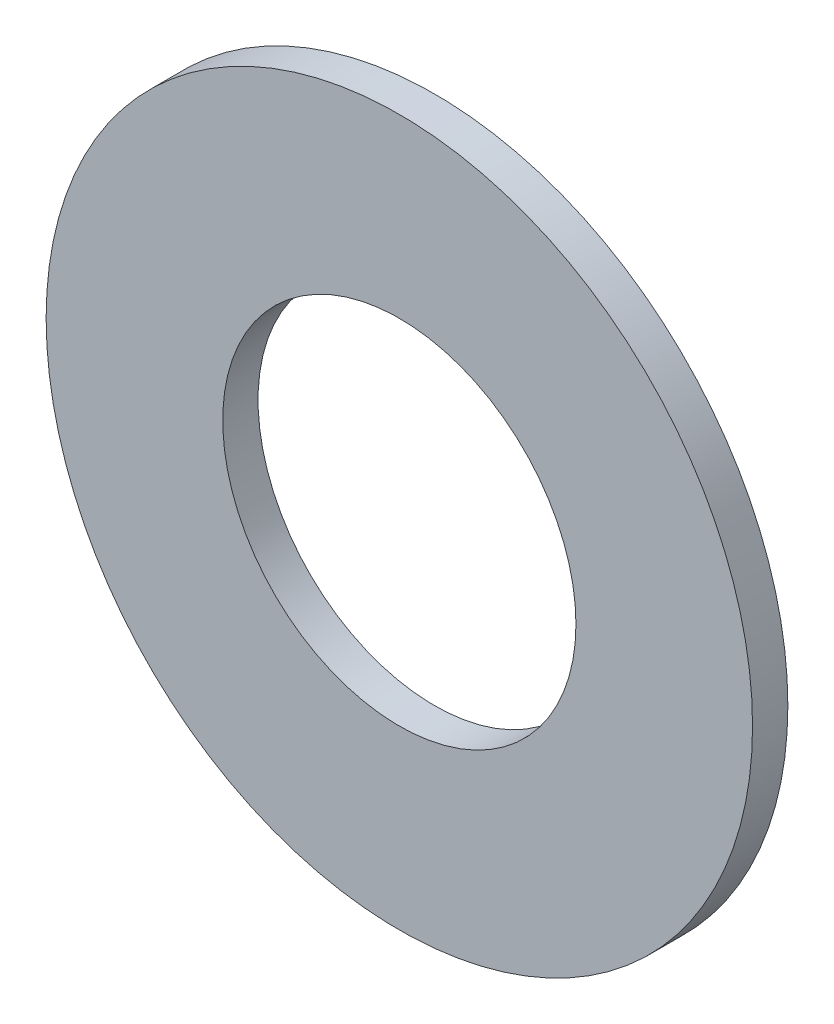
ISO-10303-21;
HEADER;
FILE_DESCRIPTION(('STEP AP214'),'2;1');
FILE_NAME('part.step','',(''),(''),'','','');
FILE_SCHEMA(('AUTOMOTIVE_DESIGN { 1 0 10303 214 1 1 1 1 }'));
ENDSEC;
DATA;
#1=APPLICATION_CONTEXT('core data for automotive mechanical design processes');
#2=APPLICATION_PROTOCOL_DEFINITION('international standard','automotive_design',2000,#1);
#3=PRODUCT_CONTEXT('',#1,'mechanical');
#4=PRODUCT('Part','Part','',(#3));
#5=PRODUCT_RELATED_PRODUCT_CATEGORY('part','',(#4));
#6=PRODUCT_DEFINITION_FORMATION('','',#4);
#7=PRODUCT_DEFINITION_CONTEXT('part definition',#1,'design');
#8=PRODUCT_DEFINITION('design','',#6,#7);
#9=PRODUCT_DEFINITION_SHAPE('','',#8);
#10=(LENGTH_UNIT() NAMED_UNIT(*) SI_UNIT(.MILLI.,.METRE.));
#11=(NAMED_UNIT(*) PLANE_ANGLE_UNIT() SI_UNIT($,.RADIAN.));
#12=(NAMED_UNIT(*) SI_UNIT($,.STERADIAN.) SOLID_ANGLE_UNIT());
#13=UNCERTAINTY_MEASURE_WITH_UNIT(LENGTH_MEASURE(1.E-05),#10,'distance_accuracy_value','');
#14=(GEOMETRIC_REPRESENTATION_CONTEXT(3) GLOBAL_UNCERTAINTY_ASSIGNED_CONTEXT((#13)) GLOBAL_UNIT_ASSIGNED_CONTEXT((#10,
#11,#12)) REPRESENTATION_CONTEXT('',''));
#15=CARTESIAN_POINT('',(0.,0.,0.));
#16=DIRECTION('',(0.,0.,1.));
#17=DIRECTION('',(1.,0.,0.));
#18=AXIS2_PLACEMENT_3D('',#15,#16,#17);
#19=CARTESIAN_POINT('',(0.,0.,0.5));
#20=DIRECTION('',(0.,0.,1.));
#21=DIRECTION('',(1.,0.,0.));
#22=AXIS2_PLACEMENT_3D('',#19,#20,#21);
#23=PLANE('',#22);
#24=CARTESIAN_POINT('',(0.,0.,0.5));
#25=DIRECTION('',(0.,0.,1.));
#26=DIRECTION('',(1.,0.,0.));
#27=AXIS2_PLACEMENT_3D('',#24,#25,#26);
#28=CIRCLE('',#27,5.);
#29=CARTESIAN_POINT('',(5.,0.,0.5));
#30=VERTEX_POINT('',#29);
#31=EDGE_CURVE('E10',#30,#30,#28,.T.);
#32=ORIENTED_EDGE('',*,*,#31,.T.);
#33=EDGE_LOOP('',(#32));
#34=FACE_BOUND('',#33,.T.);
#35=CARTESIAN_POINT('',(0.,0.,0.5));
#36=DIRECTION('',(0.,0.,1.));
#37=DIRECTION('',(1.,0.,0.));
#38=AXIS2_PLACEMENT_3D('',#35,#36,#37);
#39=CIRCLE('',#38,2.5);
#40=CARTESIAN_POINT('',(2.5,0.,0.5));
#41=VERTEX_POINT('',#40);
#42=EDGE_CURVE('E52',#41,#41,#39,.T.);
#43=ORIENTED_EDGE('',*,*,#42,.F.);
#44=EDGE_LOOP('',(#43));
#45=FACE_BOUND('',#44,.T.);
#46=ADVANCED_FACE('F39',(#34,#45),#23,.T.);
#47=CARTESIAN_POINT('',(0.,0.,0.));
#48=DIRECTION('',(0.,0.,1.));
#49=DIRECTION('',(1.,0.,0.));
#50=AXIS2_PLACEMENT_3D('',#47,#48,#49);
#51=PLANE('',#50);
#52=CARTESIAN_POINT('',(0.,0.,0.));
#53=DIRECTION('',(0.,0.,1.));
#54=DIRECTION('',(1.,0.,0.));
#55=AXIS2_PLACEMENT_3D('',#52,#53,#54);
#56=CIRCLE('',#55,5.);
#57=CARTESIAN_POINT('',(5.,0.,0.));
#58=VERTEX_POINT('',#57);
#59=EDGE_CURVE('E43',#58,#58,#56,.T.);
#60=ORIENTED_EDGE('',*,*,#59,.F.);
#61=EDGE_LOOP('',(#60));
#62=FACE_BOUND('',#61,.T.);
#63=CARTESIAN_POINT('',(0.,0.,0.));
#64=DIRECTION('',(0.,0.,1.));
#65=DIRECTION('',(1.,0.,0.));
#66=AXIS2_PLACEMENT_3D('',#63,#64,#65);
#67=CIRCLE('',#66,2.5);
#68=CARTESIAN_POINT('',(2.5,0.,0.));
#69=VERTEX_POINT('',#68);
#70=EDGE_CURVE('E54',#69,#69,#67,.T.);
#71=ORIENTED_EDGE('',*,*,#70,.T.);
#72=EDGE_LOOP('',(#71));
#73=FACE_BOUND('',#72,.T.);
#74=ADVANCED_FACE('F66',(#62,#73),#51,.F.);
#75=CARTESIAN_POINT('',(0.,0.,0.5));
#76=DIRECTION('',(0.,0.,-1.));
#77=DIRECTION('',(-1.,0.,0.));
#78=AXIS2_PLACEMENT_3D('',#75,#76,#77);
#79=CYLINDRICAL_SURFACE('',#78,5.);
#80=ORIENTED_EDGE('',*,*,#31,.F.);
#81=EDGE_LOOP('',(#80));
#82=FACE_BOUND('',#81,.T.);
#83=ORIENTED_EDGE('',*,*,#59,.T.);
#84=EDGE_LOOP('',(#83));
#85=FACE_BOUND('',#84,.T.);
#86=ADVANCED_FACE('F41',(#82,#85),#79,.T.);
#87=CARTESIAN_POINT('',(0.,0.,0.5));
#88=DIRECTION('',(0.,0.,-1.));
#89=DIRECTION('',(-1.,0.,0.));
#90=AXIS2_PLACEMENT_3D('',#87,#88,#89);
#91=CYLINDRICAL_SURFACE('',#90,2.5);
#92=ORIENTED_EDGE('',*,*,#42,.T.);
#93=EDGE_LOOP('',(#92));
#94=FACE_BOUND('',#93,.T.);
#95=ORIENTED_EDGE('',*,*,#70,.F.);
#96=EDGE_LOOP('',(#95));
#97=FACE_BOUND('',#96,.T.);
#98=ADVANCED_FACE('F62',(#94,#97),#91,.F.);
#99=CLOSED_SHELL('',(#46,#74,#86,#98));
#100=MANIFOLD_SOLID_BREP('B2',#99);
#101=ADVANCED_BREP_SHAPE_REPRESENTATION('',(#18,#100),#14);
#102=SHAPE_DEFINITION_REPRESENTATION(#9,#101);
ENDSEC;
END-ISO-10303-21;
